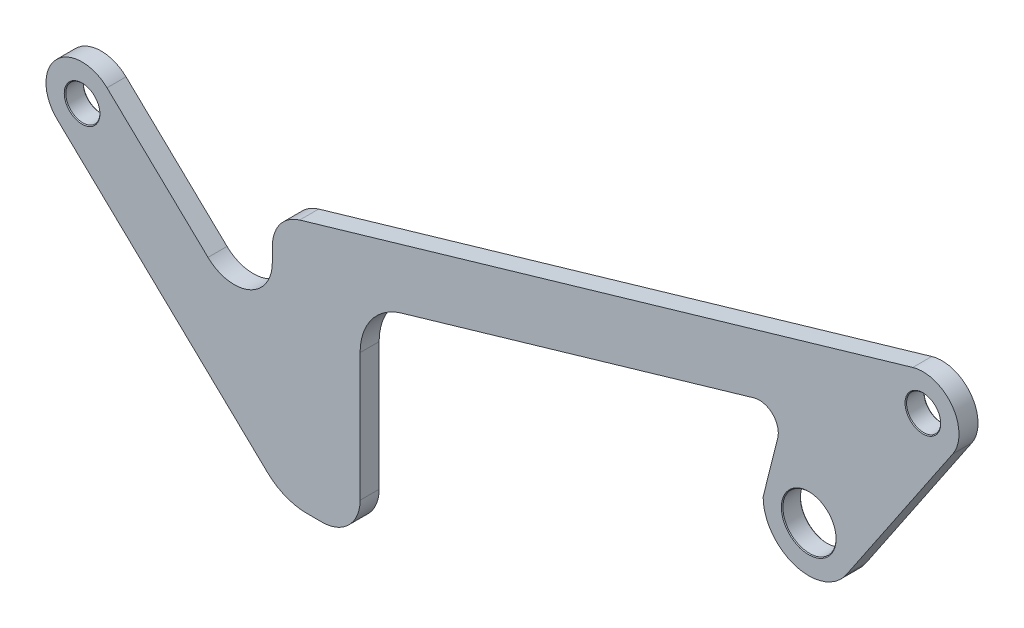
ISO-10303-21;
HEADER;
FILE_DESCRIPTION(('STEP AP214'),'2;1');
FILE_NAME('part.step','',(''),(''),'','','');
FILE_SCHEMA(('AUTOMOTIVE_DESIGN { 1 0 10303 214 1 1 1 1 }'));
ENDSEC;
DATA;
#1=APPLICATION_CONTEXT('core data for automotive mechanical design processes');
#2=APPLICATION_PROTOCOL_DEFINITION('international standard','automotive_design',2000,#1);
#3=PRODUCT_CONTEXT('',#1,'mechanical');
#4=PRODUCT('Part','Part','',(#3));
#5=PRODUCT_RELATED_PRODUCT_CATEGORY('part','',(#4));
#6=PRODUCT_DEFINITION_FORMATION('','',#4);
#7=PRODUCT_DEFINITION_CONTEXT('part definition',#1,'design');
#8=PRODUCT_DEFINITION('design','',#6,#7);
#9=PRODUCT_DEFINITION_SHAPE('','',#8);
#10=(LENGTH_UNIT() NAMED_UNIT(*) SI_UNIT(.MILLI.,.METRE.));
#11=(NAMED_UNIT(*) PLANE_ANGLE_UNIT() SI_UNIT($,.RADIAN.));
#12=(NAMED_UNIT(*) SI_UNIT($,.STERADIAN.) SOLID_ANGLE_UNIT());
#13=UNCERTAINTY_MEASURE_WITH_UNIT(LENGTH_MEASURE(1.E-05),#10,'distance_accuracy_value','');
#14=(GEOMETRIC_REPRESENTATION_CONTEXT(3) GLOBAL_UNCERTAINTY_ASSIGNED_CONTEXT((#13)) GLOBAL_UNIT_ASSIGNED_CONTEXT((#10,
#11,#12)) REPRESENTATION_CONTEXT('',''));
#15=CARTESIAN_POINT('',(0.,0.,0.));
#16=DIRECTION('',(0.,0.,1.));
#17=DIRECTION('',(1.,0.,0.));
#18=AXIS2_PLACEMENT_3D('',#15,#16,#17);
#19=CARTESIAN_POINT('',(-151.,-11.2228576199505,5.));
#20=DIRECTION('',(0.,0.,-1.));
#21=DIRECTION('',(-1.,0.,0.));
#22=AXIS2_PLACEMENT_3D('',#19,#20,#21);
#23=PLANE('',#22);
#24=CARTESIAN_POINT('',(30.,40.,5.));
#25=DIRECTION('',(0.,0.,-1.));
#26=DIRECTION('',(-1.,0.,0.));
#27=AXIS2_PLACEMENT_3D('',#24,#25,#26);
#28=CIRCLE('',#27,4.69000000000003);
#29=CARTESIAN_POINT('',(25.31,40.,5.));
#30=VERTEX_POINT('',#29);
#31=EDGE_CURVE('E11',#30,#30,#28,.T.);
#32=ORIENTED_EDGE('',*,*,#31,.T.);
#33=EDGE_LOOP('',(#32));
#34=FACE_BOUND('',#33,.T.);
#35=CARTESIAN_POINT('',(0.,0.,5.));
#36=DIRECTION('',(0.,0.,-1.));
#37=DIRECTION('',(-1.,0.,0.));
#38=AXIS2_PLACEMENT_3D('',#35,#36,#37);
#39=CIRCLE('',#38,7.18999999999992);
#40=CARTESIAN_POINT('',(-7.18999999999992,0.,5.));
#41=VERTEX_POINT('',#40);
#42=EDGE_CURVE('E349',#41,#41,#39,.T.);
#43=ORIENTED_EDGE('',*,*,#42,.T.);
#44=EDGE_LOOP('',(#43));
#45=FACE_BOUND('',#44,.T.);
#46=CARTESIAN_POINT('',(-191.,0.,5.));
#47=DIRECTION('',(0.,0.,-1.));
#48=DIRECTION('',(-1.,0.,0.));
#49=AXIS2_PLACEMENT_3D('',#46,#47,#48);
#50=CIRCLE('',#49,4.68999999999994);
#51=CARTESIAN_POINT('',(-195.69,0.,5.));
#52=VERTEX_POINT('',#51);
#53=EDGE_CURVE('E333',#52,#52,#50,.T.);
#54=ORIENTED_EDGE('',*,*,#53,.T.);
#55=EDGE_LOOP('',(#54));
#56=FACE_BOUND('',#55,.T.);
#57=CARTESIAN_POINT('',(-151.,-11.2228576199505,5.));
#58=DIRECTION('',(0.,0.,-1.));
#59=DIRECTION('',(-1.,0.,0.));
#60=AXIS2_PLACEMENT_3D('',#57,#58,#59);
#61=CIRCLE('',#60,10.);
#62=CARTESIAN_POINT('',(-141.,-11.2228576199505,5.));
#63=VERTEX_POINT('',#62);
#64=CARTESIAN_POINT('',(-157.902605290482,-18.4584667998199,5.));
#65=VERTEX_POINT('',#64);
#66=EDGE_CURVE('E259',#63,#65,#61,.T.);
#67=ORIENTED_EDGE('',*,*,#66,.T.);
#68=DIRECTION('',(-0.723560917986935,0.690260529048202,0.));
#69=VECTOR('',#68,1.);
#70=CARTESIAN_POINT('',(-184.449427579333,6.86659311169602,5.));
#71=LINE('',#70,#69);
#72=CARTESIAN_POINT('',(-184.449427579333,6.86659311169602,5.));
#73=VERTEX_POINT('',#72);
#74=EDGE_CURVE('E136',#65,#73,#71,.T.);
#75=ORIENTED_EDGE('',*,*,#74,.T.);
#76=CARTESIAN_POINT('',(-191.,0.,5.));
#77=DIRECTION('',(0.,0.,1.));
#78=DIRECTION('',(1.,0.,0.));
#79=AXIS2_PLACEMENT_3D('',#76,#77,#78);
#80=CIRCLE('',#79,9.48999999999999);
#81=CARTESIAN_POINT('',(-197.550572420667,-6.86659311169601,5.));
#82=VERTEX_POINT('',#81);
#83=EDGE_CURVE('E713',#73,#82,#80,.T.);
#84=ORIENTED_EDGE('',*,*,#83,.T.);
#85=DIRECTION('',(0.723560917986936,-0.690260529048201,0.));
#86=VECTOR('',#85,1.);
#87=CARTESIAN_POINT('',(-197.550572420667,-6.86659311169601,5.));
#88=LINE('',#87,#86);
#89=CARTESIAN_POINT('',(-142.270365562473,-59.6026432261669,5.));
#90=VERTEX_POINT('',#89);
#91=EDGE_CURVE('E725',#82,#90,#88,.T.);
#92=ORIENTED_EDGE('',*,*,#91,.T.);
#93=CARTESIAN_POINT('',(-131.916457626749,-48.7492294563629,5.));
#94=DIRECTION('',(0.,0.,1.));
#95=DIRECTION('',(-1.,0.,0.));
#96=AXIS2_PLACEMENT_3D('',#93,#94,#95);
#97=CIRCLE('',#96,15.);
#98=CARTESIAN_POINT('',(-131.916457626749,-63.7492294563629,5.));
#99=VERTEX_POINT('',#98);
#100=EDGE_CURVE('E721',#90,#99,#97,.T.);
#101=ORIENTED_EDGE('',*,*,#100,.T.);
#102=DIRECTION('',(1.,0.,0.));
#103=VECTOR('',#102,1.);
#104=CARTESIAN_POINT('',(-127.923734670265,-63.7492294563629,5.));
#105=LINE('',#104,#103);
#106=CARTESIAN_POINT('',(-127.923734670265,-63.7492294563629,5.));
#107=VERTEX_POINT('',#106);
#108=EDGE_CURVE('E724',#99,#107,#105,.T.);
#109=ORIENTED_EDGE('',*,*,#108,.T.);
#110=CARTESIAN_POINT('',(-127.923734670265,-53.7492294563629,5.));
#111=DIRECTION('',(0.,0.,1.));
#112=DIRECTION('',(1.,0.,0.));
#113=AXIS2_PLACEMENT_3D('',#110,#111,#112);
#114=CIRCLE('',#113,9.99999999999999);
#115=CARTESIAN_POINT('',(-117.923734670265,-53.7492294563629,5.));
#116=VERTEX_POINT('',#115);
#117=EDGE_CURVE('E728',#107,#116,#114,.T.);
#118=ORIENTED_EDGE('',*,*,#117,.T.);
#119=DIRECTION('',(0.,1.,0.));
#120=VECTOR('',#119,1.);
#121=CARTESIAN_POINT('',(-117.923734670265,-20.1425863608508,5.));
#122=LINE('',#121,#120);
#123=CARTESIAN_POINT('',(-117.923734670265,-20.1425863608508,5.));
#124=VERTEX_POINT('',#123);
#125=EDGE_CURVE('E736',#116,#124,#122,.T.);
#126=ORIENTED_EDGE('',*,*,#125,.T.);
#127=CARTESIAN_POINT('',(-102.923734670265,-20.1425863608507,5.));
#128=DIRECTION('',(0.,0.,-1.));
#129=DIRECTION('',(-1.,0.,0.));
#130=AXIS2_PLACEMENT_3D('',#127,#128,#129);
#131=CIRCLE('',#130,15.);
#132=CARTESIAN_POINT('',(-107.124555832585,-5.74282589193305,5.));
#133=VERTEX_POINT('',#132);
#134=EDGE_CURVE('E739',#124,#133,#131,.T.);
#135=ORIENTED_EDGE('',*,*,#134,.T.);
#136=DIRECTION('',(0.95998403126118,0.280054744154662,0.));
#137=VECTOR('',#136,1.);
#138=CARTESIAN_POINT('',(-107.124555832585,-5.74282589193305,5.));
#139=LINE('',#138,#137);
#140=CARTESIAN_POINT('',(-14.3979783231367,21.308163598621,5.));
#141=VERTEX_POINT('',#140);
#142=EDGE_CURVE('E742',#133,#141,#139,.T.);
#143=ORIENTED_EDGE('',*,*,#142,.T.);
#144=CARTESIAN_POINT('',(-12.9977046023634,16.5082434423151,5.));
#145=DIRECTION('',(0.,0.,-1.));
#146=DIRECTION('',(1.,0.,0.));
#147=AXIS2_PLACEMENT_3D('',#144,#145,#146);
#148=CIRCLE('',#147,5.);
#149=CARTESIAN_POINT('',(-8.14842176705149,15.2898609148841,5.));
#150=VERTEX_POINT('',#149);
#151=EDGE_CURVE('E745',#141,#150,#148,.T.);
#152=ORIENTED_EDGE('',*,*,#151,.T.);
#153=DIRECTION('',(-0.243676505486203,-0.969856567062384,0.));
#154=VECTOR('',#153,1.);
#155=CARTESIAN_POINT('',(-8.14842176705149,15.2898609148841,5.));
#156=LINE('',#155,#154);
#157=CARTESIAN_POINT('',(-11.99,0.,5.));
#158=VERTEX_POINT('',#157);
#159=EDGE_CURVE('E748',#150,#158,#156,.T.);
#160=ORIENTED_EDGE('',*,*,#159,.T.);
#161=CARTESIAN_POINT('',(0.,0.,5.));
#162=DIRECTION('',(0.,0.,1.));
#163=DIRECTION('',(1.,0.,0.));
#164=AXIS2_PLACEMENT_3D('',#161,#162,#163);
#165=CIRCLE('',#164,11.99);
#166=CARTESIAN_POINT('',(9.93970249686815,-6.70540187265111,5.));
#167=VERTEX_POINT('',#166);
#168=EDGE_CURVE('E750',#158,#167,#165,.T.);
#169=ORIENTED_EDGE('',*,*,#168,.T.);
#170=DIRECTION('',(0.559249530663145,0.828999374217527,0.));
#171=VECTOR('',#170,1.);
#172=CARTESIAN_POINT('',(37.8672040613243,34.6927219540067,5.));
#173=LINE('',#172,#171);
#174=CARTESIAN_POINT('',(37.8672040613243,34.6927219540067,5.));
#175=VERTEX_POINT('',#174);
#176=EDGE_CURVE('E753',#167,#175,#173,.T.);
#177=ORIENTED_EDGE('',*,*,#176,.T.);
#178=CARTESIAN_POINT('',(30.,40.,5.));
#179=DIRECTION('',(0.,0.,1.));
#180=DIRECTION('',(1.,0.,0.));
#181=AXIS2_PLACEMENT_3D('',#178,#179,#180);
#182=CIRCLE('',#181,9.49000000000001);
#183=CARTESIAN_POINT('',(27.3422804779723,49.1102484566686,5.));
#184=VERTEX_POINT('',#183);
#185=EDGE_CURVE('E184',#175,#184,#182,.T.);
#186=ORIENTED_EDGE('',*,*,#185,.T.);
#187=DIRECTION('',(-0.95998403126118,-0.280054744154662,0.));
#188=VECTOR('',#187,1.);
#189=CARTESIAN_POINT('',(-133.800547441547,2.1002858158614,5.));
#190=LINE('',#189,#188);
#191=CARTESIAN_POINT('',(-133.800547441547,2.1002858158614,5.));
#192=VERTEX_POINT('',#191);
#193=EDGE_CURVE('E179',#184,#192,#190,.T.);
#194=ORIENTED_EDGE('',*,*,#193,.T.);
#195=CARTESIAN_POINT('',(-131.,-7.49955449675042,5.));
#196=DIRECTION('',(0.,0.,1.));
#197=DIRECTION('',(1.,0.,0.));
#198=AXIS2_PLACEMENT_3D('',#195,#196,#197);
#199=CIRCLE('',#198,10.);
#200=CARTESIAN_POINT('',(-141.,-7.49955449675047,5.));
#201=VERTEX_POINT('',#200);
#202=EDGE_CURVE('E182',#192,#201,#199,.T.);
#203=ORIENTED_EDGE('',*,*,#202,.T.);
#204=DIRECTION('',(0.,-1.,0.));
#205=VECTOR('',#204,1.);
#206=CARTESIAN_POINT('',(-141.,-7.49955449675047,5.));
#207=LINE('',#206,#205);
#208=EDGE_CURVE('E62',#201,#63,#207,.T.);
#209=ORIENTED_EDGE('',*,*,#208,.T.);
#210=EDGE_LOOP('',(#67,#75,#84,#92,#101,#109,#118,#126,#135,#143,#152,#160,#169,#177,#186,#194,
#203,#209));
#211=FACE_BOUND('',#210,.T.);
#212=ADVANCED_FACE('F43',(#34,#45,#56,#211),#23,.F.);
#213=CARTESIAN_POINT('',(-151.,-11.2228576199505,0.));
#214=DIRECTION('',(0.,0.,-1.));
#215=DIRECTION('',(-1.,0.,0.));
#216=AXIS2_PLACEMENT_3D('',#213,#214,#215);
#217=PLANE('',#216);
#218=CARTESIAN_POINT('',(30.,40.,0.));
#219=DIRECTION('',(0.,0.,-1.));
#220=DIRECTION('',(-1.,0.,0.));
#221=AXIS2_PLACEMENT_3D('',#218,#219,#220);
#222=CIRCLE('',#221,4.69);
#223=CARTESIAN_POINT('',(25.31,40.,0.));
#224=VERTEX_POINT('',#223);
#225=EDGE_CURVE('E353',#224,#224,#222,.F.);
#226=ORIENTED_EDGE('',*,*,#225,.T.);
#227=EDGE_LOOP('',(#226));
#228=FACE_BOUND('',#227,.T.);
#229=CARTESIAN_POINT('',(0.,0.,0.));
#230=DIRECTION('',(0.,0.,-1.));
#231=DIRECTION('',(-1.,0.,0.));
#232=AXIS2_PLACEMENT_3D('',#229,#230,#231);
#233=CIRCLE('',#232,7.19);
#234=CARTESIAN_POINT('',(-7.19,0.,0.));
#235=VERTEX_POINT('',#234);
#236=EDGE_CURVE('E337',#235,#235,#233,.F.);
#237=ORIENTED_EDGE('',*,*,#236,.T.);
#238=EDGE_LOOP('',(#237));
#239=FACE_BOUND('',#238,.T.);
#240=CARTESIAN_POINT('',(-191.,0.,0.));
#241=DIRECTION('',(0.,0.,-1.));
#242=DIRECTION('',(-1.,0.,0.));
#243=AXIS2_PLACEMENT_3D('',#240,#241,#242);
#244=CIRCLE('',#243,4.69);
#245=CARTESIAN_POINT('',(-195.69,0.,0.));
#246=VERTEX_POINT('',#245);
#247=EDGE_CURVE('E321',#246,#246,#244,.F.);
#248=ORIENTED_EDGE('',*,*,#247,.T.);
#249=EDGE_LOOP('',(#248));
#250=FACE_BOUND('',#249,.T.);
#251=CARTESIAN_POINT('',(-151.,-11.2228576199505,0.));
#252=DIRECTION('',(0.,0.,-1.));
#253=DIRECTION('',(-1.,0.,0.));
#254=AXIS2_PLACEMENT_3D('',#251,#252,#253);
#255=CIRCLE('',#254,10.);
#256=CARTESIAN_POINT('',(-141.,-11.2228576199505,0.));
#257=VERTEX_POINT('',#256);
#258=CARTESIAN_POINT('',(-157.902605290482,-18.4584667998199,0.));
#259=VERTEX_POINT('',#258);
#260=EDGE_CURVE('E208',#257,#259,#255,.T.);
#261=ORIENTED_EDGE('',*,*,#260,.F.);
#262=DIRECTION('',(0.,-1.,0.));
#263=VECTOR('',#262,1.);
#264=CARTESIAN_POINT('',(-141.,-7.49955449675047,0.));
#265=LINE('',#264,#263);
#266=CARTESIAN_POINT('',(-141.,-7.49955449675047,0.));
#267=VERTEX_POINT('',#266);
#268=EDGE_CURVE('E127',#267,#257,#265,.T.);
#269=ORIENTED_EDGE('',*,*,#268,.F.);
#270=CARTESIAN_POINT('',(-131.,-7.49955449675042,0.));
#271=DIRECTION('',(0.,0.,1.));
#272=DIRECTION('',(1.,0.,0.));
#273=AXIS2_PLACEMENT_3D('',#270,#271,#272);
#274=CIRCLE('',#273,10.);
#275=CARTESIAN_POINT('',(-133.800547441547,2.1002858158614,0.));
#276=VERTEX_POINT('',#275);
#277=EDGE_CURVE('E121',#276,#267,#274,.T.);
#278=ORIENTED_EDGE('',*,*,#277,.F.);
#279=DIRECTION('',(-0.95998403126118,-0.280054744154662,0.));
#280=VECTOR('',#279,1.);
#281=CARTESIAN_POINT('',(-133.800547441547,2.1002858158614,0.));
#282=LINE('',#281,#280);
#283=CARTESIAN_POINT('',(27.3422804779723,49.1102484566686,0.));
#284=VERTEX_POINT('',#283);
#285=EDGE_CURVE('E193',#284,#276,#282,.T.);
#286=ORIENTED_EDGE('',*,*,#285,.F.);
#287=CARTESIAN_POINT('',(30.,40.,0.));
#288=DIRECTION('',(0.,0.,1.));
#289=DIRECTION('',(1.,0.,0.));
#290=AXIS2_PLACEMENT_3D('',#287,#288,#289);
#291=CIRCLE('',#290,9.49000000000001);
#292=CARTESIAN_POINT('',(37.8672040613243,34.6927219540067,0.));
#293=VERTEX_POINT('',#292);
#294=EDGE_CURVE('E250',#293,#284,#291,.T.);
#295=ORIENTED_EDGE('',*,*,#294,.F.);
#296=DIRECTION('',(0.559249530663145,0.828999374217527,0.));
#297=VECTOR('',#296,1.);
#298=CARTESIAN_POINT('',(37.8672040613243,34.6927219540067,0.));
#299=LINE('',#298,#297);
#300=CARTESIAN_POINT('',(9.93970249686815,-6.70540187265111,0.));
#301=VERTEX_POINT('',#300);
#302=EDGE_CURVE('E247',#301,#293,#299,.T.);
#303=ORIENTED_EDGE('',*,*,#302,.F.);
#304=CARTESIAN_POINT('',(0.,0.,0.));
#305=DIRECTION('',(0.,0.,1.));
#306=DIRECTION('',(1.,0.,0.));
#307=AXIS2_PLACEMENT_3D('',#304,#305,#306);
#308=CIRCLE('',#307,11.99);
#309=CARTESIAN_POINT('',(-11.99,0.,0.));
#310=VERTEX_POINT('',#309);
#311=EDGE_CURVE('E244',#310,#301,#308,.T.);
#312=ORIENTED_EDGE('',*,*,#311,.F.);
#313=DIRECTION('',(-0.243676505486203,-0.969856567062384,0.));
#314=VECTOR('',#313,1.);
#315=CARTESIAN_POINT('',(-8.14842176705149,15.2898609148841,0.));
#316=LINE('',#315,#314);
#317=CARTESIAN_POINT('',(-8.14842176705149,15.2898609148841,0.));
#318=VERTEX_POINT('',#317);
#319=EDGE_CURVE('E241',#318,#310,#316,.T.);
#320=ORIENTED_EDGE('',*,*,#319,.F.);
#321=CARTESIAN_POINT('',(-12.9977046023634,16.5082434423151,0.));
#322=DIRECTION('',(0.,0.,-1.));
#323=DIRECTION('',(1.,0.,0.));
#324=AXIS2_PLACEMENT_3D('',#321,#322,#323);
#325=CIRCLE('',#324,5.);
#326=CARTESIAN_POINT('',(-14.3979783231367,21.308163598621,0.));
#327=VERTEX_POINT('',#326);
#328=EDGE_CURVE('E239',#327,#318,#325,.T.);
#329=ORIENTED_EDGE('',*,*,#328,.F.);
#330=DIRECTION('',(0.95998403126118,0.280054744154662,0.));
#331=VECTOR('',#330,1.);
#332=CARTESIAN_POINT('',(-107.124555832585,-5.74282589193305,0.));
#333=LINE('',#332,#331);
#334=CARTESIAN_POINT('',(-107.124555832585,-5.74282589193305,0.));
#335=VERTEX_POINT('',#334);
#336=EDGE_CURVE('E236',#335,#327,#333,.T.);
#337=ORIENTED_EDGE('',*,*,#336,.F.);
#338=CARTESIAN_POINT('',(-102.923734670265,-20.1425863608507,0.));
#339=DIRECTION('',(0.,0.,-1.));
#340=DIRECTION('',(-1.,0.,0.));
#341=AXIS2_PLACEMENT_3D('',#338,#339,#340);
#342=CIRCLE('',#341,15.);
#343=CARTESIAN_POINT('',(-117.923734670265,-20.1425863608508,0.));
#344=VERTEX_POINT('',#343);
#345=EDGE_CURVE('E233',#344,#335,#342,.T.);
#346=ORIENTED_EDGE('',*,*,#345,.F.);
#347=DIRECTION('',(0.,1.,0.));
#348=VECTOR('',#347,1.);
#349=CARTESIAN_POINT('',(-117.923734670265,-20.1425863608508,0.));
#350=LINE('',#349,#348);
#351=CARTESIAN_POINT('',(-117.923734670265,-53.7492294563629,0.));
#352=VERTEX_POINT('',#351);
#353=EDGE_CURVE('E230',#352,#344,#350,.T.);
#354=ORIENTED_EDGE('',*,*,#353,.F.);
#355=CARTESIAN_POINT('',(-127.923734670265,-53.7492294563629,0.));
#356=DIRECTION('',(0.,0.,1.));
#357=DIRECTION('',(1.,0.,0.));
#358=AXIS2_PLACEMENT_3D('',#355,#356,#357);
#359=CIRCLE('',#358,9.99999999999999);
#360=CARTESIAN_POINT('',(-127.923734670265,-63.7492294563629,0.));
#361=VERTEX_POINT('',#360);
#362=EDGE_CURVE('E227',#361,#352,#359,.T.);
#363=ORIENTED_EDGE('',*,*,#362,.F.);
#364=DIRECTION('',(1.,0.,0.));
#365=VECTOR('',#364,1.);
#366=CARTESIAN_POINT('',(-127.923734670265,-63.7492294563629,0.));
#367=LINE('',#366,#365);
#368=CARTESIAN_POINT('',(-131.916457626749,-63.7492294563629,0.));
#369=VERTEX_POINT('',#368);
#370=EDGE_CURVE('E224',#369,#361,#367,.T.);
#371=ORIENTED_EDGE('',*,*,#370,.F.);
#372=CARTESIAN_POINT('',(-131.916457626749,-48.7492294563629,0.));
#373=DIRECTION('',(0.,0.,1.));
#374=DIRECTION('',(-1.,0.,0.));
#375=AXIS2_PLACEMENT_3D('',#372,#373,#374);
#376=CIRCLE('',#375,15.);
#377=CARTESIAN_POINT('',(-142.270365562473,-59.6026432261669,0.));
#378=VERTEX_POINT('',#377);
#379=EDGE_CURVE('E221',#378,#369,#376,.T.);
#380=ORIENTED_EDGE('',*,*,#379,.F.);
#381=DIRECTION('',(0.723560917986936,-0.690260529048201,0.));
#382=VECTOR('',#381,1.);
#383=CARTESIAN_POINT('',(-197.550572420667,-6.86659311169601,0.));
#384=LINE('',#383,#382);
#385=CARTESIAN_POINT('',(-197.550572420667,-6.86659311169601,0.));
#386=VERTEX_POINT('',#385);
#387=EDGE_CURVE('E218',#386,#378,#384,.T.);
#388=ORIENTED_EDGE('',*,*,#387,.F.);
#389=CARTESIAN_POINT('',(-191.,0.,0.));
#390=DIRECTION('',(0.,0.,1.));
#391=DIRECTION('',(1.,0.,0.));
#392=AXIS2_PLACEMENT_3D('',#389,#390,#391);
#393=CIRCLE('',#392,9.48999999999999);
#394=CARTESIAN_POINT('',(-184.449427579333,6.86659311169602,0.));
#395=VERTEX_POINT('',#394);
#396=EDGE_CURVE('E215',#395,#386,#393,.T.);
#397=ORIENTED_EDGE('',*,*,#396,.F.);
#398=DIRECTION('',(-0.723560917986935,0.690260529048202,0.));
#399=VECTOR('',#398,1.);
#400=CARTESIAN_POINT('',(-184.449427579333,6.86659311169602,0.));
#401=LINE('',#400,#399);
#402=EDGE_CURVE('E212',#259,#395,#401,.T.);
#403=ORIENTED_EDGE('',*,*,#402,.F.);
#404=EDGE_LOOP('',(#261,#269,#278,#286,#295,#303,#312,#320,#329,#337,#346,#354,#363,#371,#380,
#388,#397,#403));
#405=FACE_BOUND('',#404,.T.);
#406=ADVANCED_FACE('F374',(#228,#239,#250,#405),#217,.T.);
#407=CARTESIAN_POINT('',(-151.,-11.2228576199505,5.));
#408=DIRECTION('',(0.,0.,-1.));
#409=DIRECTION('',(-1.,0.,0.));
#410=AXIS2_PLACEMENT_3D('',#407,#408,#409);
#411=CYLINDRICAL_SURFACE('',#410,10.);
#412=ORIENTED_EDGE('',*,*,#260,.T.);
#413=DIRECTION('',(0.,0.,-1.));
#414=VECTOR('',#413,1.);
#415=CARTESIAN_POINT('',(-157.902605290482,-18.4584667998199,5.));
#416=LINE('',#415,#414);
#417=EDGE_CURVE('E318',#65,#259,#416,.T.);
#418=ORIENTED_EDGE('',*,*,#417,.F.);
#419=ORIENTED_EDGE('',*,*,#66,.F.);
#420=DIRECTION('',(0.,0.,-1.));
#421=VECTOR('',#420,1.);
#422=CARTESIAN_POINT('',(-141.,-11.2228576199505,5.));
#423=LINE('',#422,#421);
#424=EDGE_CURVE('E204',#63,#257,#423,.T.);
#425=ORIENTED_EDGE('',*,*,#424,.T.);
#426=EDGE_LOOP('',(#412,#418,#419,#425));
#427=FACE_BOUND('',#426,.T.);
#428=ADVANCED_FACE('F377',(#427),#411,.F.);
#429=CARTESIAN_POINT('',(-184.449427579333,6.86659311169602,5.));
#430=DIRECTION('',(-0.690260529048202,-0.723560917986935,0.));
#431=DIRECTION('',(0.723560917986935,-0.690260529048202,0.));
#432=AXIS2_PLACEMENT_3D('',#429,#430,#431);
#433=PLANE('',#432);
#434=ORIENTED_EDGE('',*,*,#402,.T.);
#435=DIRECTION('',(0.,0.,-1.));
#436=VECTOR('',#435,1.);
#437=CARTESIAN_POINT('',(-184.449427579333,6.86659311169602,5.));
#438=LINE('',#437,#436);
#439=EDGE_CURVE('E314',#73,#395,#438,.T.);
#440=ORIENTED_EDGE('',*,*,#439,.F.);
#441=ORIENTED_EDGE('',*,*,#74,.F.);
#442=ORIENTED_EDGE('',*,*,#417,.T.);
#443=EDGE_LOOP('',(#434,#440,#441,#442));
#444=FACE_BOUND('',#443,.T.);
#445=ADVANCED_FACE('F677',(#444),#433,.F.);
#446=CARTESIAN_POINT('',(-191.,0.,5.));
#447=DIRECTION('',(0.,0.,-1.));
#448=DIRECTION('',(-1.,0.,0.));
#449=AXIS2_PLACEMENT_3D('',#446,#447,#448);
#450=CYLINDRICAL_SURFACE('',#449,9.48999999999999);
#451=ORIENTED_EDGE('',*,*,#396,.T.);
#452=DIRECTION('',(0.,0.,-1.));
#453=VECTOR('',#452,1.);
#454=CARTESIAN_POINT('',(-197.550572420667,-6.86659311169601,5.));
#455=LINE('',#454,#453);
#456=EDGE_CURVE('E310',#82,#386,#455,.T.);
#457=ORIENTED_EDGE('',*,*,#456,.F.);
#458=ORIENTED_EDGE('',*,*,#83,.F.);
#459=ORIENTED_EDGE('',*,*,#439,.T.);
#460=EDGE_LOOP('',(#451,#457,#458,#459));
#461=FACE_BOUND('',#460,.T.);
#462=ADVANCED_FACE('F667',(#461),#450,.T.);
#463=CARTESIAN_POINT('',(-197.550572420667,-6.86659311169601,5.));
#464=DIRECTION('',(0.690260529048201,0.723560917986936,0.));
#465=DIRECTION('',(-0.723560917986936,0.690260529048201,0.));
#466=AXIS2_PLACEMENT_3D('',#463,#464,#465);
#467=PLANE('',#466);
#468=ORIENTED_EDGE('',*,*,#387,.T.);
#469=DIRECTION('',(0.,0.,-1.));
#470=VECTOR('',#469,1.);
#471=CARTESIAN_POINT('',(-142.270365562473,-59.6026432261669,5.));
#472=LINE('',#471,#470);
#473=EDGE_CURVE('E306',#90,#378,#472,.T.);
#474=ORIENTED_EDGE('',*,*,#473,.F.);
#475=ORIENTED_EDGE('',*,*,#91,.F.);
#476=ORIENTED_EDGE('',*,*,#456,.T.);
#477=EDGE_LOOP('',(#468,#474,#475,#476));
#478=FACE_BOUND('',#477,.T.);
#479=ADVANCED_FACE('F657',(#478),#467,.F.);
#480=CARTESIAN_POINT('',(-131.916457626749,-48.7492294563629,5.));
#481=DIRECTION('',(0.,0.,-1.));
#482=DIRECTION('',(-1.,0.,0.));
#483=AXIS2_PLACEMENT_3D('',#480,#481,#482);
#484=CYLINDRICAL_SURFACE('',#483,15.);
#485=ORIENTED_EDGE('',*,*,#379,.T.);
#486=DIRECTION('',(0.,0.,-1.));
#487=VECTOR('',#486,1.);
#488=CARTESIAN_POINT('',(-131.916457626749,-63.7492294563629,5.));
#489=LINE('',#488,#487);
#490=EDGE_CURVE('E302',#99,#369,#489,.T.);
#491=ORIENTED_EDGE('',*,*,#490,.F.);
#492=ORIENTED_EDGE('',*,*,#100,.F.);
#493=ORIENTED_EDGE('',*,*,#473,.T.);
#494=EDGE_LOOP('',(#485,#491,#492,#493));
#495=FACE_BOUND('',#494,.T.);
#496=ADVANCED_FACE('F647',(#495),#484,.T.);
#497=CARTESIAN_POINT('',(-127.923734670265,-63.7492294563629,5.));
#498=DIRECTION('',(0.,1.,0.));
#499=DIRECTION('',(-1.,0.,0.));
#500=AXIS2_PLACEMENT_3D('',#497,#498,#499);
#501=PLANE('',#500);
#502=ORIENTED_EDGE('',*,*,#370,.T.);
#503=DIRECTION('',(0.,0.,-1.));
#504=VECTOR('',#503,1.);
#505=CARTESIAN_POINT('',(-127.923734670265,-63.7492294563629,5.));
#506=LINE('',#505,#504);
#507=EDGE_CURVE('E298',#107,#361,#506,.T.);
#508=ORIENTED_EDGE('',*,*,#507,.F.);
#509=ORIENTED_EDGE('',*,*,#108,.F.);
#510=ORIENTED_EDGE('',*,*,#490,.T.);
#511=EDGE_LOOP('',(#502,#508,#509,#510));
#512=FACE_BOUND('',#511,.T.);
#513=ADVANCED_FACE('F637',(#512),#501,.F.);
#514=CARTESIAN_POINT('',(-127.923734670265,-53.7492294563629,5.));
#515=DIRECTION('',(0.,0.,-1.));
#516=DIRECTION('',(-1.,0.,0.));
#517=AXIS2_PLACEMENT_3D('',#514,#515,#516);
#518=CYLINDRICAL_SURFACE('',#517,9.99999999999999);
#519=ORIENTED_EDGE('',*,*,#362,.T.);
#520=DIRECTION('',(0.,0.,-1.));
#521=VECTOR('',#520,1.);
#522=CARTESIAN_POINT('',(-117.923734670265,-53.7492294563629,5.));
#523=LINE('',#522,#521);
#524=EDGE_CURVE('E294',#116,#352,#523,.T.);
#525=ORIENTED_EDGE('',*,*,#524,.F.);
#526=ORIENTED_EDGE('',*,*,#117,.F.);
#527=ORIENTED_EDGE('',*,*,#507,.T.);
#528=EDGE_LOOP('',(#519,#525,#526,#527));
#529=FACE_BOUND('',#528,.T.);
#530=ADVANCED_FACE('F627',(#529),#518,.T.);
#531=CARTESIAN_POINT('',(-117.923734670265,-20.1425863608508,5.));
#532=DIRECTION('',(-1.,0.,0.));
#533=DIRECTION('',(0.,-1.,0.));
#534=AXIS2_PLACEMENT_3D('',#531,#532,#533);
#535=PLANE('',#534);
#536=ORIENTED_EDGE('',*,*,#353,.T.);
#537=DIRECTION('',(0.,0.,-1.));
#538=VECTOR('',#537,1.);
#539=CARTESIAN_POINT('',(-117.923734670265,-20.1425863608508,5.));
#540=LINE('',#539,#538);
#541=EDGE_CURVE('E290',#124,#344,#540,.T.);
#542=ORIENTED_EDGE('',*,*,#541,.F.);
#543=ORIENTED_EDGE('',*,*,#125,.F.);
#544=ORIENTED_EDGE('',*,*,#524,.T.);
#545=EDGE_LOOP('',(#536,#542,#543,#544));
#546=FACE_BOUND('',#545,.T.);
#547=ADVANCED_FACE('F617',(#546),#535,.F.);
#548=CARTESIAN_POINT('',(-102.923734670265,-20.1425863608507,5.));
#549=DIRECTION('',(0.,0.,-1.));
#550=DIRECTION('',(-1.,0.,0.));
#551=AXIS2_PLACEMENT_3D('',#548,#549,#550);
#552=CYLINDRICAL_SURFACE('',#551,15.);
#553=ORIENTED_EDGE('',*,*,#345,.T.);
#554=DIRECTION('',(0.,0.,-1.));
#555=VECTOR('',#554,1.);
#556=CARTESIAN_POINT('',(-107.124555832585,-5.74282589193305,5.));
#557=LINE('',#556,#555);
#558=EDGE_CURVE('E286',#133,#335,#557,.T.);
#559=ORIENTED_EDGE('',*,*,#558,.F.);
#560=ORIENTED_EDGE('',*,*,#134,.F.);
#561=ORIENTED_EDGE('',*,*,#541,.T.);
#562=EDGE_LOOP('',(#553,#559,#560,#561));
#563=FACE_BOUND('',#562,.T.);
#564=ADVANCED_FACE('F607',(#563),#552,.F.);
#565=CARTESIAN_POINT('',(-107.124555832585,-5.74282589193305,5.));
#566=DIRECTION('',(-0.280054744154662,0.95998403126118,0.));
#567=DIRECTION('',(-0.95998403126118,-0.280054744154662,0.));
#568=AXIS2_PLACEMENT_3D('',#565,#566,#567);
#569=PLANE('',#568);
#570=ORIENTED_EDGE('',*,*,#336,.T.);
#571=DIRECTION('',(0.,0.,-1.));
#572=VECTOR('',#571,1.);
#573=CARTESIAN_POINT('',(-14.3979783231367,21.308163598621,5.));
#574=LINE('',#573,#572);
#575=EDGE_CURVE('E282',#141,#327,#574,.T.);
#576=ORIENTED_EDGE('',*,*,#575,.F.);
#577=ORIENTED_EDGE('',*,*,#142,.F.);
#578=ORIENTED_EDGE('',*,*,#558,.T.);
#579=EDGE_LOOP('',(#570,#576,#577,#578));
#580=FACE_BOUND('',#579,.T.);
#581=ADVANCED_FACE('F597',(#580),#569,.F.);
#582=CARTESIAN_POINT('',(-12.9977046023634,16.5082434423151,5.));
#583=DIRECTION('',(0.,0.,-1.));
#584=DIRECTION('',(-1.,0.,0.));
#585=AXIS2_PLACEMENT_3D('',#582,#583,#584);
#586=CYLINDRICAL_SURFACE('',#585,5.);
#587=ORIENTED_EDGE('',*,*,#328,.T.);
#588=DIRECTION('',(0.,0.,-1.));
#589=VECTOR('',#588,1.);
#590=CARTESIAN_POINT('',(-8.14842176705149,15.2898609148841,5.));
#591=LINE('',#590,#589);
#592=EDGE_CURVE('E278',#150,#318,#591,.T.);
#593=ORIENTED_EDGE('',*,*,#592,.F.);
#594=ORIENTED_EDGE('',*,*,#151,.F.);
#595=ORIENTED_EDGE('',*,*,#575,.T.);
#596=EDGE_LOOP('',(#587,#593,#594,#595));
#597=FACE_BOUND('',#596,.T.);
#598=ADVANCED_FACE('F587',(#597),#586,.F.);
#599=CARTESIAN_POINT('',(-8.14842176705149,15.2898609148841,5.));
#600=DIRECTION('',(0.969856567062384,-0.243676505486203,0.));
#601=DIRECTION('',(0.243676505486203,0.969856567062384,0.));
#602=AXIS2_PLACEMENT_3D('',#599,#600,#601);
#603=PLANE('',#602);
#604=ORIENTED_EDGE('',*,*,#319,.T.);
#605=DIRECTION('',(0.,0.,-1.));
#606=VECTOR('',#605,1.);
#607=CARTESIAN_POINT('',(-11.99,0.,5.));
#608=LINE('',#607,#606);
#609=EDGE_CURVE('E274',#158,#310,#608,.T.);
#610=ORIENTED_EDGE('',*,*,#609,.F.);
#611=ORIENTED_EDGE('',*,*,#159,.F.);
#612=ORIENTED_EDGE('',*,*,#592,.T.);
#613=EDGE_LOOP('',(#604,#610,#611,#612));
#614=FACE_BOUND('',#613,.T.);
#615=ADVANCED_FACE('F577',(#614),#603,.F.);
#616=CARTESIAN_POINT('',(0.,0.,5.));
#617=DIRECTION('',(0.,0.,-1.));
#618=DIRECTION('',(-1.,0.,0.));
#619=AXIS2_PLACEMENT_3D('',#616,#617,#618);
#620=CYLINDRICAL_SURFACE('',#619,11.99);
#621=ORIENTED_EDGE('',*,*,#311,.T.);
#622=DIRECTION('',(0.,0.,-1.));
#623=VECTOR('',#622,1.);
#624=CARTESIAN_POINT('',(9.93970249686815,-6.70540187265111,5.));
#625=LINE('',#624,#623);
#626=EDGE_CURVE('E270',#167,#301,#625,.T.);
#627=ORIENTED_EDGE('',*,*,#626,.F.);
#628=ORIENTED_EDGE('',*,*,#168,.F.);
#629=ORIENTED_EDGE('',*,*,#609,.T.);
#630=EDGE_LOOP('',(#621,#627,#628,#629));
#631=FACE_BOUND('',#630,.T.);
#632=ADVANCED_FACE('F567',(#631),#620,.T.);
#633=CARTESIAN_POINT('',(37.8672040613243,34.6927219540067,5.));
#634=DIRECTION('',(-0.828999374217527,0.559249530663145,0.));
#635=DIRECTION('',(-0.559249530663145,-0.828999374217527,0.));
#636=AXIS2_PLACEMENT_3D('',#633,#634,#635);
#637=PLANE('',#636);
#638=ORIENTED_EDGE('',*,*,#302,.T.);
#639=DIRECTION('',(0.,0.,-1.));
#640=VECTOR('',#639,1.);
#641=CARTESIAN_POINT('',(37.8672040613243,34.6927219540067,5.));
#642=LINE('',#641,#640);
#643=EDGE_CURVE('E266',#175,#293,#642,.T.);
#644=ORIENTED_EDGE('',*,*,#643,.F.);
#645=ORIENTED_EDGE('',*,*,#176,.F.);
#646=ORIENTED_EDGE('',*,*,#626,.T.);
#647=EDGE_LOOP('',(#638,#644,#645,#646));
#648=FACE_BOUND('',#647,.T.);
#649=ADVANCED_FACE('F557',(#648),#637,.F.);
#650=CARTESIAN_POINT('',(30.,40.,5.));
#651=DIRECTION('',(0.,0.,-1.));
#652=DIRECTION('',(-1.,0.,0.));
#653=AXIS2_PLACEMENT_3D('',#650,#651,#652);
#654=CYLINDRICAL_SURFACE('',#653,9.49000000000001);
#655=ORIENTED_EDGE('',*,*,#294,.T.);
#656=DIRECTION('',(0.,0.,-1.));
#657=VECTOR('',#656,1.);
#658=CARTESIAN_POINT('',(27.3422804779723,49.1102484566686,5.));
#659=LINE('',#658,#657);
#660=EDGE_CURVE('E195',#184,#284,#659,.T.);
#661=ORIENTED_EDGE('',*,*,#660,.F.);
#662=ORIENTED_EDGE('',*,*,#185,.F.);
#663=ORIENTED_EDGE('',*,*,#643,.T.);
#664=EDGE_LOOP('',(#655,#661,#662,#663));
#665=FACE_BOUND('',#664,.T.);
#666=ADVANCED_FACE('F548',(#665),#654,.T.);
#667=CARTESIAN_POINT('',(-133.800547441547,2.1002858158614,5.));
#668=DIRECTION('',(0.280054744154662,-0.95998403126118,0.));
#669=DIRECTION('',(0.95998403126118,0.280054744154662,0.));
#670=AXIS2_PLACEMENT_3D('',#667,#668,#669);
#671=PLANE('',#670);
#672=ORIENTED_EDGE('',*,*,#285,.T.);
#673=DIRECTION('',(0.,0.,-1.));
#674=VECTOR('',#673,1.);
#675=CARTESIAN_POINT('',(-133.800547441547,2.1002858158614,5.));
#676=LINE('',#675,#674);
#677=EDGE_CURVE('E190',#192,#276,#676,.T.);
#678=ORIENTED_EDGE('',*,*,#677,.F.);
#679=ORIENTED_EDGE('',*,*,#193,.F.);
#680=ORIENTED_EDGE('',*,*,#660,.T.);
#681=EDGE_LOOP('',(#672,#678,#679,#680));
#682=FACE_BOUND('',#681,.T.);
#683=ADVANCED_FACE('F191',(#682),#671,.F.);
#684=CARTESIAN_POINT('',(-131.,-7.49955449675042,5.));
#685=DIRECTION('',(0.,0.,-1.));
#686=DIRECTION('',(-1.,0.,0.));
#687=AXIS2_PLACEMENT_3D('',#684,#685,#686);
#688=CYLINDRICAL_SURFACE('',#687,10.);
#689=ORIENTED_EDGE('',*,*,#277,.T.);
#690=DIRECTION('',(0.,0.,-1.));
#691=VECTOR('',#690,1.);
#692=CARTESIAN_POINT('',(-141.,-7.49955449675047,5.));
#693=LINE('',#692,#691);
#694=EDGE_CURVE('E196',#201,#267,#693,.T.);
#695=ORIENTED_EDGE('',*,*,#694,.F.);
#696=ORIENTED_EDGE('',*,*,#202,.F.);
#697=ORIENTED_EDGE('',*,*,#677,.T.);
#698=EDGE_LOOP('',(#689,#695,#696,#697));
#699=FACE_BOUND('',#698,.T.);
#700=ADVANCED_FACE('F198',(#699),#688,.T.);
#701=CARTESIAN_POINT('',(-141.,-7.49955449675047,5.));
#702=DIRECTION('',(1.,0.,0.));
#703=DIRECTION('',(0.,0.,-1.));
#704=AXIS2_PLACEMENT_3D('',#701,#702,#703);
#705=PLANE('',#704);
#706=ORIENTED_EDGE('',*,*,#268,.T.);
#707=ORIENTED_EDGE('',*,*,#424,.F.);
#708=ORIENTED_EDGE('',*,*,#208,.F.);
#709=ORIENTED_EDGE('',*,*,#694,.T.);
#710=EDGE_LOOP('',(#706,#707,#708,#709));
#711=FACE_BOUND('',#710,.T.);
#712=ADVANCED_FACE('F388',(#711),#705,.F.);
#713=CARTESIAN_POINT('',(0.,0.,5.));
#714=DIRECTION('',(0.,0.,-1.));
#715=DIRECTION('',(-1.,0.,0.));
#716=AXIS2_PLACEMENT_3D('',#713,#714,#715);
#717=CYLINDRICAL_SURFACE('',#716,6.99);
#718=CARTESIAN_POINT('',(0.,0.,0.199999999999991));
#719=DIRECTION('',(0.,0.,-1.));
#720=DIRECTION('',(-1.,0.,0.));
#721=AXIS2_PLACEMENT_3D('',#718,#719,#720);
#722=CIRCLE('',#721,6.99);
#723=CARTESIAN_POINT('',(-6.99,0.,0.199999999999991));
#724=VERTEX_POINT('',#723);
#725=EDGE_CURVE('E345',#724,#724,#722,.T.);
#726=ORIENTED_EDGE('',*,*,#725,.T.);
#727=EDGE_LOOP('',(#726));
#728=FACE_BOUND('',#727,.T.);
#729=CARTESIAN_POINT('',(0.,0.,4.80000000000007));
#730=DIRECTION('',(0.,0.,-1.));
#731=DIRECTION('',(-1.,0.,0.));
#732=AXIS2_PLACEMENT_3D('',#729,#730,#731);
#733=CIRCLE('',#732,6.99);
#734=CARTESIAN_POINT('',(-6.99,0.,4.80000000000007));
#735=VERTEX_POINT('',#734);
#736=EDGE_CURVE('E341',#735,#735,#733,.F.);
#737=ORIENTED_EDGE('',*,*,#736,.T.);
#738=EDGE_LOOP('',(#737));
#739=FACE_BOUND('',#738,.T.);
#740=ADVANCED_FACE('F390',(#728,#739),#717,.F.);
#741=CARTESIAN_POINT('',(-191.,0.,5.));
#742=DIRECTION('',(0.,0.,-1.));
#743=DIRECTION('',(-1.,0.,0.));
#744=AXIS2_PLACEMENT_3D('',#741,#742,#743);
#745=CYLINDRICAL_SURFACE('',#744,4.48999999999998);
#746=CARTESIAN_POINT('',(-191.,0.,0.200000000000007));
#747=DIRECTION('',(0.,0.,-1.));
#748=DIRECTION('',(-1.,0.,0.));
#749=AXIS2_PLACEMENT_3D('',#746,#747,#748);
#750=CIRCLE('',#749,4.48999999999998);
#751=CARTESIAN_POINT('',(-195.49,0.,0.200000000000007));
#752=VERTEX_POINT('',#751);
#753=EDGE_CURVE('E329',#752,#752,#750,.T.);
#754=ORIENTED_EDGE('',*,*,#753,.T.);
#755=EDGE_LOOP('',(#754));
#756=FACE_BOUND('',#755,.T.);
#757=CARTESIAN_POINT('',(-191.,0.,4.80000000000004));
#758=DIRECTION('',(0.,0.,-1.));
#759=DIRECTION('',(-1.,0.,0.));
#760=AXIS2_PLACEMENT_3D('',#757,#758,#759);
#761=CIRCLE('',#760,4.48999999999998);
#762=CARTESIAN_POINT('',(-195.49,0.,4.80000000000004));
#763=VERTEX_POINT('',#762);
#764=EDGE_CURVE('E325',#763,#763,#761,.F.);
#765=ORIENTED_EDGE('',*,*,#764,.T.);
#766=EDGE_LOOP('',(#765));
#767=FACE_BOUND('',#766,.T.);
#768=ADVANCED_FACE('F396',(#756,#767),#745,.F.);
#769=CARTESIAN_POINT('',(30.,40.,5.));
#770=DIRECTION('',(0.,0.,-1.));
#771=DIRECTION('',(-1.,0.,0.));
#772=AXIS2_PLACEMENT_3D('',#769,#770,#771);
#773=CYLINDRICAL_SURFACE('',#772,4.49);
#774=CARTESIAN_POINT('',(30.,40.,0.199999999999989));
#775=DIRECTION('',(0.,0.,-1.));
#776=DIRECTION('',(-1.,0.,0.));
#777=AXIS2_PLACEMENT_3D('',#774,#775,#776);
#778=CIRCLE('',#777,4.49);
#779=CARTESIAN_POINT('',(25.51,40.,0.199999999999989));
#780=VERTEX_POINT('',#779);
#781=EDGE_CURVE('E54',#780,#780,#778,.T.);
#782=ORIENTED_EDGE('',*,*,#781,.T.);
#783=EDGE_LOOP('',(#782));
#784=FACE_BOUND('',#783,.T.);
#785=CARTESIAN_POINT('',(30.,40.,4.79999999999997));
#786=DIRECTION('',(0.,0.,-1.));
#787=DIRECTION('',(-1.,0.,0.));
#788=AXIS2_PLACEMENT_3D('',#785,#786,#787);
#789=CIRCLE('',#788,4.49);
#790=CARTESIAN_POINT('',(25.51,40.,4.79999999999997));
#791=VERTEX_POINT('',#790);
#792=EDGE_CURVE('E357',#791,#791,#789,.F.);
#793=ORIENTED_EDGE('',*,*,#792,.T.);
#794=EDGE_LOOP('',(#793));
#795=FACE_BOUND('',#794,.T.);
#796=ADVANCED_FACE('F365',(#784,#795),#773,.F.);
#797=CARTESIAN_POINT('',(-191.,0.,0.));
#798=DIRECTION('',(0.,0.,-1.));
#799=DIRECTION('',(-1.,0.,0.));
#800=AXIS2_PLACEMENT_3D('',#797,#798,#799);
#801=CONICAL_SURFACE('',#800,4.69,0.785398163397479);
#802=ORIENTED_EDGE('',*,*,#753,.F.);
#803=EDGE_LOOP('',(#802));
#804=FACE_BOUND('',#803,.T.);
#805=ORIENTED_EDGE('',*,*,#247,.F.);
#806=EDGE_LOOP('',(#805));
#807=FACE_BOUND('',#806,.T.);
#808=ADVANCED_FACE('F411',(#804,#807),#801,.F.);
#809=CARTESIAN_POINT('',(-191.,0.,4.80000000000004));
#810=DIRECTION('',(0.,0.,1.));
#811=DIRECTION('',(1.,0.,0.));
#812=AXIS2_PLACEMENT_3D('',#809,#810,#811);
#813=CONICAL_SURFACE('',#812,4.48999999999998,0.785398163397457);
#814=ORIENTED_EDGE('',*,*,#53,.F.);
#815=EDGE_LOOP('',(#814));
#816=FACE_BOUND('',#815,.T.);
#817=ORIENTED_EDGE('',*,*,#764,.F.);
#818=EDGE_LOOP('',(#817));
#819=FACE_BOUND('',#818,.T.);
#820=ADVANCED_FACE('F415',(#816,#819),#813,.F.);
#821=CARTESIAN_POINT('',(0.,0.,0.));
#822=DIRECTION('',(0.,0.,-1.));
#823=DIRECTION('',(-1.,0.,0.));
#824=AXIS2_PLACEMENT_3D('',#821,#822,#823);
#825=CONICAL_SURFACE('',#824,7.19,0.785398163397472);
#826=ORIENTED_EDGE('',*,*,#725,.F.);
#827=EDGE_LOOP('',(#826));
#828=FACE_BOUND('',#827,.T.);
#829=ORIENTED_EDGE('',*,*,#236,.F.);
#830=EDGE_LOOP('',(#829));
#831=FACE_BOUND('',#830,.T.);
#832=ADVANCED_FACE('F421',(#828,#831),#825,.F.);
#833=CARTESIAN_POINT('',(0.,0.,4.80000000000007));
#834=DIRECTION('',(0.,0.,1.));
#835=DIRECTION('',(1.,0.,0.));
#836=AXIS2_PLACEMENT_3D('',#833,#834,#835);
#837=CONICAL_SURFACE('',#836,6.99,0.785398163397424);
#838=ORIENTED_EDGE('',*,*,#42,.F.);
#839=EDGE_LOOP('',(#838));
#840=FACE_BOUND('',#839,.T.);
#841=ORIENTED_EDGE('',*,*,#736,.F.);
#842=EDGE_LOOP('',(#841));
#843=FACE_BOUND('',#842,.T.);
#844=ADVANCED_FACE('F371',(#840,#843),#837,.F.);
#845=CARTESIAN_POINT('',(30.,40.,0.));
#846=DIRECTION('',(0.,0.,-1.));
#847=DIRECTION('',(-1.,0.,0.));
#848=AXIS2_PLACEMENT_3D('',#845,#846,#847);
#849=CONICAL_SURFACE('',#848,4.69,0.785398163397479);
#850=ORIENTED_EDGE('',*,*,#781,.F.);
#851=EDGE_LOOP('',(#850));
#852=FACE_BOUND('',#851,.T.);
#853=ORIENTED_EDGE('',*,*,#225,.F.);
#854=EDGE_LOOP('',(#853));
#855=FACE_BOUND('',#854,.T.);
#856=ADVANCED_FACE('F368',(#852,#855),#849,.F.);
#857=CARTESIAN_POINT('',(30.,40.,4.79999999999997));
#858=DIRECTION('',(0.,0.,1.));
#859=DIRECTION('',(1.,0.,0.));
#860=AXIS2_PLACEMENT_3D('',#857,#858,#859);
#861=CONICAL_SURFACE('',#860,4.49,0.785398163397457);
#862=ORIENTED_EDGE('',*,*,#31,.F.);
#863=EDGE_LOOP('',(#862));
#864=FACE_BOUND('',#863,.T.);
#865=ORIENTED_EDGE('',*,*,#792,.F.);
#866=EDGE_LOOP('',(#865));
#867=FACE_BOUND('',#866,.T.);
#868=ADVANCED_FACE('F46',(#864,#867),#861,.F.);
#869=CLOSED_SHELL('',(#212,#406,#428,#445,#462,#479,#496,#513,#530,#547,#564,#581,#598,#615,
#632,#649,#666,#683,#700,#712,#740,#768,#796,#808,#820,#832,#844,#856,#868));
#870=MANIFOLD_SOLID_BREP('B2',#869);
#871=ADVANCED_BREP_SHAPE_REPRESENTATION('',(#18,#870),#14);
#872=SHAPE_DEFINITION_REPRESENTATION(#9,#871);
ENDSEC;
END-ISO-10303-21;
